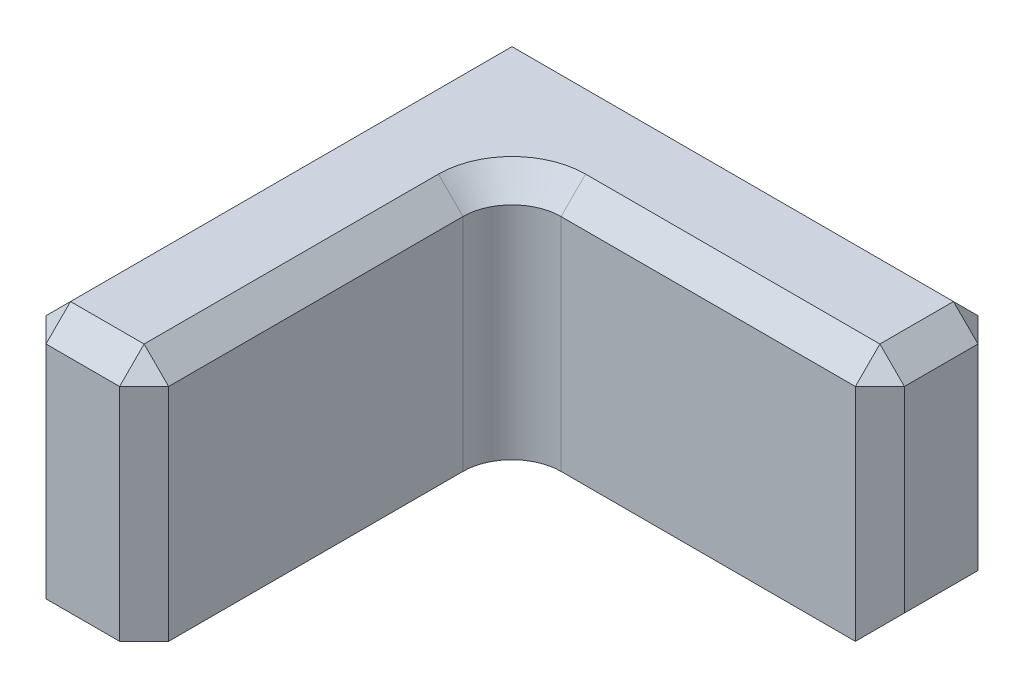
ISO-10303-21;
HEADER;
FILE_DESCRIPTION(('STEP AP214'),'2;1');
FILE_NAME('part.step','',(''),(''),'','','');
FILE_SCHEMA(('AUTOMOTIVE_DESIGN { 1 0 10303 214 1 1 1 1 }'));
ENDSEC;
DATA;
#1=APPLICATION_CONTEXT('core data for automotive mechanical design processes');
#2=APPLICATION_PROTOCOL_DEFINITION('international standard','automotive_design',2000,#1);
#3=PRODUCT_CONTEXT('',#1,'mechanical');
#4=PRODUCT('Part','Part','',(#3));
#5=PRODUCT_RELATED_PRODUCT_CATEGORY('part','',(#4));
#6=PRODUCT_DEFINITION_FORMATION('','',#4);
#7=PRODUCT_DEFINITION_CONTEXT('part definition',#1,'design');
#8=PRODUCT_DEFINITION('design','',#6,#7);
#9=PRODUCT_DEFINITION_SHAPE('','',#8);
#10=(LENGTH_UNIT() NAMED_UNIT(*) SI_UNIT(.MILLI.,.METRE.));
#11=(NAMED_UNIT(*) PLANE_ANGLE_UNIT() SI_UNIT($,.RADIAN.));
#12=(NAMED_UNIT(*) SI_UNIT($,.STERADIAN.) SOLID_ANGLE_UNIT());
#13=UNCERTAINTY_MEASURE_WITH_UNIT(LENGTH_MEASURE(1.E-05),#10,'distance_accuracy_value','');
#14=(GEOMETRIC_REPRESENTATION_CONTEXT(3) GLOBAL_UNCERTAINTY_ASSIGNED_CONTEXT((#13)) GLOBAL_UNIT_ASSIGNED_CONTEXT((#10,
#11,#12)) REPRESENTATION_CONTEXT('',''));
#15=CARTESIAN_POINT('',(0.,0.,0.));
#16=DIRECTION('',(0.,0.,1.));
#17=DIRECTION('',(1.,0.,0.));
#18=AXIS2_PLACEMENT_3D('',#15,#16,#17);
#19=CARTESIAN_POINT('',(20.,10.,0.));
#20=DIRECTION('',(1.,0.,0.));
#21=DIRECTION('',(0.,0.,-1.));
#22=AXIS2_PLACEMENT_3D('',#19,#20,#21);
#23=PLANE('',#22);
#24=DIRECTION('',(0.,0.,1.));
#25=VECTOR('',#24,1.);
#26=CARTESIAN_POINT('',(20.,9.,0.));
#27=LINE('',#26,#25);
#28=CARTESIAN_POINT('',(20.,9.,1.00000000000001));
#29=VERTEX_POINT('',#28);
#30=CARTESIAN_POINT('',(20.,9.,4.));
#31=VERTEX_POINT('',#30);
#32=EDGE_CURVE('E175',#29,#31,#27,.T.);
#33=ORIENTED_EDGE('',*,*,#32,.T.);
#34=DIRECTION('',(0.,-1.,0.));
#35=VECTOR('',#34,1.);
#36=CARTESIAN_POINT('',(20.,0.,4.));
#37=LINE('',#36,#35);
#38=CARTESIAN_POINT('',(20.,1.00000000000001,4.));
#39=VERTEX_POINT('',#38);
#40=EDGE_CURVE('E193',#31,#39,#37,.T.);
#41=ORIENTED_EDGE('',*,*,#40,.T.);
#42=DIRECTION('',(0.,0.,-1.));
#43=VECTOR('',#42,1.);
#44=CARTESIAN_POINT('',(20.,1.00000000000001,0.));
#45=LINE('',#44,#43);
#46=CARTESIAN_POINT('',(20.,1.00000000000001,1.00000000000001));
#47=VERTEX_POINT('',#46);
#48=EDGE_CURVE('E191',#39,#47,#45,.T.);
#49=ORIENTED_EDGE('',*,*,#48,.T.);
#50=DIRECTION('',(0.,1.,0.));
#51=VECTOR('',#50,1.);
#52=CARTESIAN_POINT('',(20.,10.,1.00000000000001));
#53=LINE('',#52,#51);
#54=EDGE_CURVE('E189',#47,#29,#53,.T.);
#55=ORIENTED_EDGE('',*,*,#54,.T.);
#56=EDGE_LOOP('',(#33,#41,#49,#55));
#57=FACE_BOUND('',#56,.T.);
#58=ADVANCED_FACE('F45',(#57),#23,.T.);
#59=CARTESIAN_POINT('',(0.,10.,0.));
#60=DIRECTION('',(0.,0.,-1.));
#61=DIRECTION('',(-1.,0.,0.));
#62=AXIS2_PLACEMENT_3D('',#59,#60,#61);
#63=PLANE('',#62);
#64=DIRECTION('',(1.,0.,0.));
#65=VECTOR('',#64,1.);
#66=CARTESIAN_POINT('',(0.,9.,0.));
#67=LINE('',#66,#65);
#68=CARTESIAN_POINT('',(1.00000000000001,9.,0.));
#69=VERTEX_POINT('',#68);
#70=CARTESIAN_POINT('',(19.,9.,0.));
#71=VERTEX_POINT('',#70);
#72=EDGE_CURVE('E208',#69,#71,#67,.T.);
#73=ORIENTED_EDGE('',*,*,#72,.T.);
#74=DIRECTION('',(0.,-1.,0.));
#75=VECTOR('',#74,1.);
#76=CARTESIAN_POINT('',(19.,10.,0.));
#77=LINE('',#76,#75);
#78=CARTESIAN_POINT('',(19.,0.,0.));
#79=VERTEX_POINT('',#78);
#80=EDGE_CURVE('E210',#71,#79,#77,.T.);
#81=ORIENTED_EDGE('',*,*,#80,.T.);
#82=DIRECTION('',(1.,0.,0.));
#83=VECTOR('',#82,1.);
#84=CARTESIAN_POINT('',(0.,0.,0.));
#85=LINE('',#84,#83);
#86=CARTESIAN_POINT('',(1.00000000000001,0.,0.));
#87=VERTEX_POINT('',#86);
#88=EDGE_CURVE('E294',#87,#79,#85,.T.);
#89=ORIENTED_EDGE('',*,*,#88,.F.);
#90=DIRECTION('',(0.,1.,0.));
#91=VECTOR('',#90,1.);
#92=CARTESIAN_POINT('',(1.00000000000001,10.,0.));
#93=LINE('',#92,#91);
#94=EDGE_CURVE('E206',#87,#69,#93,.T.);
#95=ORIENTED_EDGE('',*,*,#94,.T.);
#96=EDGE_LOOP('',(#73,#81,#89,#95));
#97=FACE_BOUND('',#96,.T.);
#98=ADVANCED_FACE('F337',(#97),#63,.T.);
#99=CARTESIAN_POINT('',(0.,10.,0.));
#100=DIRECTION('',(1.,0.,0.));
#101=DIRECTION('',(0.,0.,-1.));
#102=AXIS2_PLACEMENT_3D('',#99,#100,#101);
#103=PLANE('',#102);
#104=DIRECTION('',(0.,0.,-1.));
#105=VECTOR('',#104,1.);
#106=CARTESIAN_POINT('',(0.,8.99999999999999,0.));
#107=LINE('',#106,#105);
#108=CARTESIAN_POINT('',(0.,8.99999999999999,19.));
#109=VERTEX_POINT('',#108);
#110=CARTESIAN_POINT('',(0.,8.99999999999999,1.));
#111=VERTEX_POINT('',#110);
#112=EDGE_CURVE('E235',#109,#111,#107,.T.);
#113=ORIENTED_EDGE('',*,*,#112,.T.);
#114=DIRECTION('',(0.,-1.,0.));
#115=VECTOR('',#114,1.);
#116=CARTESIAN_POINT('',(0.,0.,1.));
#117=LINE('',#116,#115);
#118=CARTESIAN_POINT('',(0.,0.,1.));
#119=VERTEX_POINT('',#118);
#120=EDGE_CURVE('E237',#111,#119,#117,.T.);
#121=ORIENTED_EDGE('',*,*,#120,.T.);
#122=DIRECTION('',(0.,0.,1.));
#123=VECTOR('',#122,1.);
#124=CARTESIAN_POINT('',(0.,0.,0.));
#125=LINE('',#124,#123);
#126=CARTESIAN_POINT('',(0.,0.,19.));
#127=VERTEX_POINT('',#126);
#128=EDGE_CURVE('E298',#119,#127,#125,.T.);
#129=ORIENTED_EDGE('',*,*,#128,.T.);
#130=DIRECTION('',(0.,1.,0.));
#131=VECTOR('',#130,1.);
#132=CARTESIAN_POINT('',(0.,10.,19.));
#133=LINE('',#132,#131);
#134=EDGE_CURVE('E233',#127,#109,#133,.T.);
#135=ORIENTED_EDGE('',*,*,#134,.T.);
#136=EDGE_LOOP('',(#113,#121,#129,#135));
#137=FACE_BOUND('',#136,.T.);
#138=ADVANCED_FACE('F343',(#137),#103,.F.);
#139=CARTESIAN_POINT('',(0.,10.,20.));
#140=DIRECTION('',(0.,0.,-1.));
#141=DIRECTION('',(-1.,0.,0.));
#142=AXIS2_PLACEMENT_3D('',#139,#140,#141);
#143=PLANE('',#142);
#144=DIRECTION('',(-1.,0.,0.));
#145=VECTOR('',#144,1.);
#146=CARTESIAN_POINT('',(0.,8.99999999999999,20.));
#147=LINE('',#146,#145);
#148=CARTESIAN_POINT('',(3.99999999999999,8.99999999999999,20.));
#149=VERTEX_POINT('',#148);
#150=CARTESIAN_POINT('',(1.00000000000001,8.99999999999999,20.));
#151=VERTEX_POINT('',#150);
#152=EDGE_CURVE('E55',#149,#151,#147,.T.);
#153=ORIENTED_EDGE('',*,*,#152,.T.);
#154=DIRECTION('',(0.,-1.,0.));
#155=VECTOR('',#154,1.);
#156=CARTESIAN_POINT('',(1.00000000000001,10.,20.));
#157=LINE('',#156,#155);
#158=CARTESIAN_POINT('',(1.00000000000001,0.,20.));
#159=VERTEX_POINT('',#158);
#160=EDGE_CURVE('E11',#151,#159,#157,.T.);
#161=ORIENTED_EDGE('',*,*,#160,.T.);
#162=DIRECTION('',(1.,0.,0.));
#163=VECTOR('',#162,1.);
#164=CARTESIAN_POINT('',(0.,0.,20.));
#165=LINE('',#164,#163);
#166=CARTESIAN_POINT('',(3.99999999999999,0.,20.));
#167=VERTEX_POINT('',#166);
#168=EDGE_CURVE('E183',#159,#167,#165,.T.);
#169=ORIENTED_EDGE('',*,*,#168,.T.);
#170=DIRECTION('',(0.,1.,0.));
#171=VECTOR('',#170,1.);
#172=CARTESIAN_POINT('',(3.99999999999999,10.,20.));
#173=LINE('',#172,#171);
#174=EDGE_CURVE('E66',#167,#149,#173,.T.);
#175=ORIENTED_EDGE('',*,*,#174,.T.);
#176=EDGE_LOOP('',(#153,#161,#169,#175));
#177=FACE_BOUND('',#176,.T.);
#178=ADVANCED_FACE('F305',(#177),#143,.F.);
#179=CARTESIAN_POINT('',(5.,10.,0.));
#180=DIRECTION('',(1.,0.,0.));
#181=DIRECTION('',(0.,0.,-1.));
#182=AXIS2_PLACEMENT_3D('',#179,#180,#181);
#183=PLANE('',#182);
#184=DIRECTION('',(0.,-1.,0.));
#185=VECTOR('',#184,1.);
#186=CARTESIAN_POINT('',(5.,10.,7.));
#187=LINE('',#186,#185);
#188=CARTESIAN_POINT('',(5.,0.,7.));
#189=VERTEX_POINT('',#188);
#190=CARTESIAN_POINT('',(5.,9.,7.));
#191=VERTEX_POINT('',#190);
#192=EDGE_CURVE('E166',#189,#191,#187,.F.);
#193=ORIENTED_EDGE('',*,*,#192,.T.);
#194=DIRECTION('',(0.,0.,1.));
#195=VECTOR('',#194,1.);
#196=CARTESIAN_POINT('',(5.,9.,0.));
#197=LINE('',#196,#195);
#198=CARTESIAN_POINT('',(5.,9.,19.));
#199=VERTEX_POINT('',#198);
#200=EDGE_CURVE('E231',#191,#199,#197,.T.);
#201=ORIENTED_EDGE('',*,*,#200,.T.);
#202=DIRECTION('',(0.,-1.,0.));
#203=VECTOR('',#202,1.);
#204=CARTESIAN_POINT('',(5.,0.,19.));
#205=LINE('',#204,#203);
#206=CARTESIAN_POINT('',(5.,0.,19.));
#207=VERTEX_POINT('',#206);
#208=EDGE_CURVE('E229',#199,#207,#205,.T.);
#209=ORIENTED_EDGE('',*,*,#208,.T.);
#210=DIRECTION('',(0.,0.,1.));
#211=VECTOR('',#210,1.);
#212=CARTESIAN_POINT('',(5.,0.,0.));
#213=LINE('',#212,#211);
#214=EDGE_CURVE('E181',#189,#207,#213,.T.);
#215=ORIENTED_EDGE('',*,*,#214,.F.);
#216=EDGE_LOOP('',(#193,#201,#209,#215));
#217=FACE_BOUND('',#216,.T.);
#218=ADVANCED_FACE('F584',(#217),#183,.T.);
#219=CARTESIAN_POINT('',(0.,10.,5.));
#220=DIRECTION('',(0.,0.,-1.));
#221=DIRECTION('',(-1.,0.,0.));
#222=AXIS2_PLACEMENT_3D('',#219,#220,#221);
#223=PLANE('',#222);
#224=DIRECTION('',(1.,0.,0.));
#225=VECTOR('',#224,1.);
#226=CARTESIAN_POINT('',(0.,0.,5.));
#227=LINE('',#226,#225);
#228=CARTESIAN_POINT('',(7.,0.,5.));
#229=VERTEX_POINT('',#228);
#230=CARTESIAN_POINT('',(19.,0.,5.));
#231=VERTEX_POINT('',#230);
#232=EDGE_CURVE('E160',#229,#231,#227,.T.);
#233=ORIENTED_EDGE('',*,*,#232,.T.);
#234=DIRECTION('',(0.,1.,0.));
#235=VECTOR('',#234,1.);
#236=CARTESIAN_POINT('',(19.,10.,5.));
#237=LINE('',#236,#235);
#238=CARTESIAN_POINT('',(19.,8.99999999999999,5.));
#239=VERTEX_POINT('',#238);
#240=EDGE_CURVE('E197',#231,#239,#237,.T.);
#241=ORIENTED_EDGE('',*,*,#240,.T.);
#242=DIRECTION('',(-1.,0.,0.));
#243=VECTOR('',#242,1.);
#244=CARTESIAN_POINT('',(7.,8.99999999999999,5.));
#245=LINE('',#244,#243);
#246=CARTESIAN_POINT('',(7.,8.99999999999999,5.));
#247=VERTEX_POINT('',#246);
#248=EDGE_CURVE('E163',#239,#247,#245,.T.);
#249=ORIENTED_EDGE('',*,*,#248,.T.);
#250=DIRECTION('',(0.,-1.,0.));
#251=VECTOR('',#250,1.);
#252=CARTESIAN_POINT('',(7.,10.,5.));
#253=LINE('',#252,#251);
#254=EDGE_CURVE('E155',#247,#229,#253,.T.);
#255=ORIENTED_EDGE('',*,*,#254,.T.);
#256=EDGE_LOOP('',(#233,#241,#249,#255));
#257=FACE_BOUND('',#256,.T.);
#258=ADVANCED_FACE('F157',(#257),#223,.F.);
#259=CARTESIAN_POINT('',(0.,10.,0.));
#260=DIRECTION('',(0.,1.,0.));
#261=DIRECTION('',(0.,0.,1.));
#262=AXIS2_PLACEMENT_3D('',#259,#260,#261);
#263=PLANE('',#262);
#264=CARTESIAN_POINT('',(7.,10.,7.));
#265=DIRECTION('',(0.,1.,0.));
#266=DIRECTION('',(0.,0.,1.));
#267=AXIS2_PLACEMENT_3D('',#264,#265,#266);
#268=CIRCLE('',#267,3.);
#269=CARTESIAN_POINT('',(3.99999999999999,10.,7.));
#270=VERTEX_POINT('',#269);
#271=CARTESIAN_POINT('',(7.,10.,4.));
#272=VERTEX_POINT('',#271);
#273=EDGE_CURVE('E222',#270,#272,#268,.F.);
#274=ORIENTED_EDGE('',*,*,#273,.T.);
#275=DIRECTION('',(1.,0.,0.));
#276=VECTOR('',#275,1.);
#277=CARTESIAN_POINT('',(20.,10.,4.));
#278=LINE('',#277,#276);
#279=CARTESIAN_POINT('',(19.,10.,4.));
#280=VERTEX_POINT('',#279);
#281=EDGE_CURVE('E224',#272,#280,#278,.T.);
#282=ORIENTED_EDGE('',*,*,#281,.T.);
#283=DIRECTION('',(0.,0.,-1.));
#284=VECTOR('',#283,1.);
#285=CARTESIAN_POINT('',(19.,10.,0.));
#286=LINE('',#285,#284);
#287=CARTESIAN_POINT('',(19.,10.,1.00000000000001));
#288=VERTEX_POINT('',#287);
#289=EDGE_CURVE('E218',#280,#288,#286,.T.);
#290=ORIENTED_EDGE('',*,*,#289,.T.);
#291=DIRECTION('',(-1.,0.,0.));
#292=VECTOR('',#291,1.);
#293=CARTESIAN_POINT('',(0.,10.,1.00000000000001));
#294=LINE('',#293,#292);
#295=CARTESIAN_POINT('',(1.,10.,1.00000000000001));
#296=VERTEX_POINT('',#295);
#297=EDGE_CURVE('E216',#288,#296,#294,.T.);
#298=ORIENTED_EDGE('',*,*,#297,.T.);
#299=DIRECTION('',(0.,0.,1.));
#300=VECTOR('',#299,1.);
#301=CARTESIAN_POINT('',(1.,10.,20.));
#302=LINE('',#301,#300);
#303=CARTESIAN_POINT('',(1.,10.,19.));
#304=VERTEX_POINT('',#303);
#305=EDGE_CURVE('E214',#296,#304,#302,.T.);
#306=ORIENTED_EDGE('',*,*,#305,.T.);
#307=DIRECTION('',(1.,0.,0.));
#308=VECTOR('',#307,1.);
#309=CARTESIAN_POINT('',(5.,10.,19.));
#310=LINE('',#309,#308);
#311=CARTESIAN_POINT('',(3.99999999999999,10.,19.));
#312=VERTEX_POINT('',#311);
#313=EDGE_CURVE('E212',#304,#312,#310,.T.);
#314=ORIENTED_EDGE('',*,*,#313,.T.);
#315=DIRECTION('',(0.,0.,-1.));
#316=VECTOR('',#315,1.);
#317=CARTESIAN_POINT('',(3.99999999999999,10.,0.));
#318=LINE('',#317,#316);
#319=EDGE_CURVE('E220',#312,#270,#318,.T.);
#320=ORIENTED_EDGE('',*,*,#319,.T.);
#321=EDGE_LOOP('',(#274,#282,#290,#298,#306,#314,#320));
#322=FACE_BOUND('',#321,.T.);
#323=ADVANCED_FACE('F319',(#322),#263,.T.);
#324=CARTESIAN_POINT('',(0.,0.,0.));
#325=DIRECTION('',(0.,1.,0.));
#326=DIRECTION('',(0.,0.,1.));
#327=AXIS2_PLACEMENT_3D('',#324,#325,#326);
#328=PLANE('',#327);
#329=ORIENTED_EDGE('',*,*,#88,.T.);
#330=DIRECTION('',(0.,0.,1.));
#331=VECTOR('',#330,1.);
#332=CARTESIAN_POINT('',(19.,0.,5.));
#333=LINE('',#332,#331);
#334=EDGE_CURVE('E180',#79,#231,#333,.T.);
#335=ORIENTED_EDGE('',*,*,#334,.T.);
#336=ORIENTED_EDGE('',*,*,#232,.F.);
#337=CARTESIAN_POINT('',(7.,0.,7.));
#338=DIRECTION('',(0.,1.,0.));
#339=DIRECTION('',(0.,0.,1.));
#340=AXIS2_PLACEMENT_3D('',#337,#338,#339);
#341=CIRCLE('',#340,2.);
#342=EDGE_CURVE('E169',#229,#189,#341,.T.);
#343=ORIENTED_EDGE('',*,*,#342,.T.);
#344=ORIENTED_EDGE('',*,*,#214,.T.);
#345=DIRECTION('',(-0.707106781186549,0.,0.707106781186546));
#346=VECTOR('',#345,1.);
#347=CARTESIAN_POINT('',(5.,0.,19.));
#348=LINE('',#347,#346);
#349=EDGE_CURVE('E199',#207,#167,#348,.T.);
#350=ORIENTED_EDGE('',*,*,#349,.T.);
#351=ORIENTED_EDGE('',*,*,#168,.F.);
#352=DIRECTION('',(0.707106781186549,0.,0.707106781186546));
#353=VECTOR('',#352,1.);
#354=CARTESIAN_POINT('',(1.00000000000001,0.,20.));
#355=LINE('',#354,#353);
#356=EDGE_CURVE('E201',#159,#127,#355,.F.);
#357=ORIENTED_EDGE('',*,*,#356,.T.);
#358=ORIENTED_EDGE('',*,*,#128,.F.);
#359=DIRECTION('',(0.707106781186549,0.,-0.707106781186546));
#360=VECTOR('',#359,1.);
#361=CARTESIAN_POINT('',(0.,0.,1.));
#362=LINE('',#361,#360);
#363=EDGE_CURVE('E203',#119,#87,#362,.T.);
#364=ORIENTED_EDGE('',*,*,#363,.T.);
#365=EDGE_LOOP('',(#329,#335,#336,#343,#344,#350,#351,#357,#358,#364));
#366=FACE_BOUND('',#365,.T.);
#367=ADVANCED_FACE('F178',(#366),#328,.F.);
#368=CARTESIAN_POINT('',(7.,10.,7.));
#369=DIRECTION('',(0.,-1.,0.));
#370=DIRECTION('',(0.,0.,-1.));
#371=AXIS2_PLACEMENT_3D('',#368,#369,#370);
#372=CYLINDRICAL_SURFACE('',#371,2.);
#373=ORIENTED_EDGE('',*,*,#254,.F.);
#374=CARTESIAN_POINT('',(7.,8.99999999999999,7.));
#375=DIRECTION('',(0.,1.,0.));
#376=DIRECTION('',(0.,0.,1.));
#377=AXIS2_PLACEMENT_3D('',#374,#375,#376);
#378=CIRCLE('',#377,2.);
#379=EDGE_CURVE('E227',#247,#191,#378,.T.);
#380=ORIENTED_EDGE('',*,*,#379,.T.);
#381=ORIENTED_EDGE('',*,*,#192,.F.);
#382=ORIENTED_EDGE('',*,*,#342,.F.);
#383=EDGE_LOOP('',(#373,#380,#381,#382));
#384=FACE_BOUND('',#383,.T.);
#385=ADVANCED_FACE('F170',(#384),#372,.F.);
#386=CARTESIAN_POINT('',(1.00000000000001,10.,20.));
#387=DIRECTION('',(0.707106781186546,0.,-0.707106781186549));
#388=DIRECTION('',(0.,-1.,0.));
#389=AXIS2_PLACEMENT_3D('',#386,#387,#388);
#390=PLANE('',#389);
#391=DIRECTION('',(-0.707106781186549,0.,-0.707106781186546));
#392=VECTOR('',#391,1.);
#393=CARTESIAN_POINT('',(0.500000000000004,8.99999999999999,19.5));
#394=LINE('',#393,#392);
#395=EDGE_CURVE('E50',#109,#151,#394,.F.);
#396=ORIENTED_EDGE('',*,*,#395,.F.);
#397=ORIENTED_EDGE('',*,*,#134,.F.);
#398=ORIENTED_EDGE('',*,*,#356,.F.);
#399=ORIENTED_EDGE('',*,*,#160,.F.);
#400=EDGE_LOOP('',(#396,#397,#398,#399));
#401=FACE_BOUND('',#400,.T.);
#402=ADVANCED_FACE('F48',(#401),#390,.F.);
#403=CARTESIAN_POINT('',(1.,10.,19.));
#404=DIRECTION('',(-0.577350269189626,0.577350269189624,0.577350269189628));
#405=DIRECTION('',(0.707106781186549,0.,0.707106781186546));
#406=AXIS2_PLACEMENT_3D('',#403,#404,#405);
#407=PLANE('',#406);
#408=DIRECTION('',(-0.707106781186546,-0.707106781186549,0.));
#409=VECTOR('',#408,1.);
#410=CARTESIAN_POINT('',(1.,10.,19.));
#411=LINE('',#410,#409);
#412=EDGE_CURVE('E286',#109,#304,#411,.F.);
#413=ORIENTED_EDGE('',*,*,#412,.F.);
#414=ORIENTED_EDGE('',*,*,#395,.T.);
#415=DIRECTION('',(0.,0.707106781186549,-0.707106781186546));
#416=VECTOR('',#415,1.);
#417=CARTESIAN_POINT('',(1.,10.,19.));
#418=LINE('',#417,#416);
#419=EDGE_CURVE('E288',#304,#151,#418,.F.);
#420=ORIENTED_EDGE('',*,*,#419,.F.);
#421=EDGE_LOOP('',(#413,#414,#420));
#422=FACE_BOUND('',#421,.T.);
#423=ADVANCED_FACE('F327',(#422),#407,.T.);
#424=CARTESIAN_POINT('',(5.,10.,19.));
#425=DIRECTION('',(0.707106781186546,0.,0.707106781186549));
#426=DIRECTION('',(0.,1.,0.));
#427=AXIS2_PLACEMENT_3D('',#424,#425,#426);
#428=PLANE('',#427);
#429=ORIENTED_EDGE('',*,*,#349,.F.);
#430=ORIENTED_EDGE('',*,*,#208,.F.);
#431=DIRECTION('',(0.707106781186549,0.,-0.707106781186546));
#432=VECTOR('',#431,1.);
#433=CARTESIAN_POINT('',(5.,9.,19.));
#434=LINE('',#433,#432);
#435=EDGE_CURVE('E283',#149,#199,#434,.T.);
#436=ORIENTED_EDGE('',*,*,#435,.F.);
#437=ORIENTED_EDGE('',*,*,#174,.F.);
#438=EDGE_LOOP('',(#429,#430,#436,#437));
#439=FACE_BOUND('',#438,.T.);
#440=ADVANCED_FACE('F310',(#439),#428,.T.);
#441=CARTESIAN_POINT('',(0.,10.,19.));
#442=DIRECTION('',(0.,0.707106781186546,0.707106781186549));
#443=DIRECTION('',(-1.,0.,0.));
#444=AXIS2_PLACEMENT_3D('',#441,#442,#443);
#445=PLANE('',#444);
#446=ORIENTED_EDGE('',*,*,#419,.T.);
#447=ORIENTED_EDGE('',*,*,#152,.F.);
#448=DIRECTION('',(0.,-0.707106781186549,0.707106781186546));
#449=VECTOR('',#448,1.);
#450=CARTESIAN_POINT('',(3.99999999999999,9.5,19.5));
#451=LINE('',#450,#449);
#452=EDGE_CURVE('E280',#312,#149,#451,.T.);
#453=ORIENTED_EDGE('',*,*,#452,.F.);
#454=ORIENTED_EDGE('',*,*,#313,.F.);
#455=EDGE_LOOP('',(#446,#447,#453,#454));
#456=FACE_BOUND('',#455,.T.);
#457=ADVANCED_FACE('F317',(#456),#445,.T.);
#458=CARTESIAN_POINT('',(1.,10.,0.));
#459=DIRECTION('',(-0.707106781186549,0.707106781186546,0.));
#460=DIRECTION('',(0.,0.,-1.));
#461=AXIS2_PLACEMENT_3D('',#458,#459,#460);
#462=PLANE('',#461);
#463=ORIENTED_EDGE('',*,*,#412,.T.);
#464=ORIENTED_EDGE('',*,*,#305,.F.);
#465=DIRECTION('',(0.707106781186546,0.707106781186549,0.));
#466=VECTOR('',#465,1.);
#467=CARTESIAN_POINT('',(1.,10.,1.00000000000001));
#468=LINE('',#467,#466);
#469=EDGE_CURVE('E277',#111,#296,#468,.T.);
#470=ORIENTED_EDGE('',*,*,#469,.F.);
#471=ORIENTED_EDGE('',*,*,#112,.F.);
#472=EDGE_LOOP('',(#463,#464,#470,#471));
#473=FACE_BOUND('',#472,.T.);
#474=ADVANCED_FACE('F326',(#473),#462,.T.);
#475=CARTESIAN_POINT('',(0.,10.,1.));
#476=DIRECTION('',(-0.707106781186546,0.,-0.707106781186549));
#477=DIRECTION('',(0.,1.,0.));
#478=AXIS2_PLACEMENT_3D('',#475,#476,#477);
#479=PLANE('',#478);
#480=ORIENTED_EDGE('',*,*,#363,.F.);
#481=ORIENTED_EDGE('',*,*,#120,.F.);
#482=DIRECTION('',(-0.707106781186549,0.,0.707106781186546));
#483=VECTOR('',#482,1.);
#484=CARTESIAN_POINT('',(0.500000000000004,8.99999999999999,0.500000000000002));
#485=LINE('',#484,#483);
#486=EDGE_CURVE('E274',#69,#111,#485,.T.);
#487=ORIENTED_EDGE('',*,*,#486,.F.);
#488=ORIENTED_EDGE('',*,*,#94,.F.);
#489=EDGE_LOOP('',(#480,#481,#487,#488));
#490=FACE_BOUND('',#489,.T.);
#491=ADVANCED_FACE('F433',(#490),#479,.T.);
#492=CARTESIAN_POINT('',(5.,9.,19.));
#493=DIRECTION('',(0.577350269189624,0.577350269189626,0.577350269189628));
#494=DIRECTION('',(0.,-0.707106781186549,0.707106781186546));
#495=AXIS2_PLACEMENT_3D('',#492,#493,#494);
#496=PLANE('',#495);
#497=ORIENTED_EDGE('',*,*,#452,.T.);
#498=ORIENTED_EDGE('',*,*,#435,.T.);
#499=DIRECTION('',(0.707106781186549,-0.707106781186546,0.));
#500=VECTOR('',#499,1.);
#501=CARTESIAN_POINT('',(5.,9.,19.));
#502=LINE('',#501,#500);
#503=EDGE_CURVE('E271',#312,#199,#502,.T.);
#504=ORIENTED_EDGE('',*,*,#503,.F.);
#505=EDGE_LOOP('',(#497,#498,#504));
#506=FACE_BOUND('',#505,.T.);
#507=ADVANCED_FACE('F315',(#506),#496,.T.);
#508=CARTESIAN_POINT('',(1.,10.,1.00000000000001));
#509=DIRECTION('',(-0.577350269189626,0.577350269189626,-0.577350269189626));
#510=DIRECTION('',(-0.707106781186548,-0.707106781186548,0.));
#511=AXIS2_PLACEMENT_3D('',#508,#509,#510);
#512=PLANE('',#511);
#513=ORIENTED_EDGE('',*,*,#486,.T.);
#514=ORIENTED_EDGE('',*,*,#469,.T.);
#515=DIRECTION('',(0.,0.707106781186546,0.707106781186549));
#516=VECTOR('',#515,1.);
#517=CARTESIAN_POINT('',(1.,10.,1.00000000000001));
#518=LINE('',#517,#516);
#519=EDGE_CURVE('E268',#69,#296,#518,.T.);
#520=ORIENTED_EDGE('',*,*,#519,.F.);
#521=EDGE_LOOP('',(#513,#514,#520));
#522=FACE_BOUND('',#521,.T.);
#523=ADVANCED_FACE('F420',(#522),#512,.T.);
#524=CARTESIAN_POINT('',(5.,9.,0.));
#525=DIRECTION('',(-0.707106781186546,-0.707106781186549,0.));
#526=DIRECTION('',(0.,0.,1.));
#527=AXIS2_PLACEMENT_3D('',#524,#525,#526);
#528=PLANE('',#527);
#529=ORIENTED_EDGE('',*,*,#503,.T.);
#530=ORIENTED_EDGE('',*,*,#200,.F.);
#531=DIRECTION('',(0.707106781186549,-0.707106781186546,0.));
#532=VECTOR('',#531,1.);
#533=CARTESIAN_POINT('',(3.99999999999999,10.,7.));
#534=LINE('',#533,#532);
#535=EDGE_CURVE('E265',#270,#191,#534,.T.);
#536=ORIENTED_EDGE('',*,*,#535,.F.);
#537=ORIENTED_EDGE('',*,*,#319,.F.);
#538=EDGE_LOOP('',(#529,#530,#536,#537));
#539=FACE_BOUND('',#538,.T.);
#540=ADVANCED_FACE('F413',(#539),#528,.F.);
#541=CARTESIAN_POINT('',(0.,9.,0.));
#542=DIRECTION('',(0.,-0.707106781186549,0.707106781186546));
#543=DIRECTION('',(1.,0.,0.));
#544=AXIS2_PLACEMENT_3D('',#541,#542,#543);
#545=PLANE('',#544);
#546=ORIENTED_EDGE('',*,*,#519,.T.);
#547=ORIENTED_EDGE('',*,*,#297,.F.);
#548=DIRECTION('',(0.,-0.707106781186546,-0.707106781186549));
#549=VECTOR('',#548,1.);
#550=CARTESIAN_POINT('',(19.,9.5,0.500000000000004));
#551=LINE('',#550,#549);
#552=EDGE_CURVE('E262',#71,#288,#551,.F.);
#553=ORIENTED_EDGE('',*,*,#552,.F.);
#554=ORIENTED_EDGE('',*,*,#72,.F.);
#555=EDGE_LOOP('',(#546,#547,#553,#554));
#556=FACE_BOUND('',#555,.T.);
#557=ADVANCED_FACE('F406',(#556),#545,.F.);
#558=CARTESIAN_POINT('',(7.,10.,7.));
#559=DIRECTION('',(0.,1.,0.));
#560=DIRECTION('',(0.,0.,1.));
#561=AXIS2_PLACEMENT_3D('',#558,#559,#560);
#562=CONICAL_SURFACE('',#561,3.,0.785398163397447);
#563=ORIENTED_EDGE('',*,*,#535,.T.);
#564=ORIENTED_EDGE('',*,*,#379,.F.);
#565=DIRECTION('',(0.,-0.707106781186549,0.707106781186546));
#566=VECTOR('',#565,1.);
#567=CARTESIAN_POINT('',(7.,10.,4.));
#568=LINE('',#567,#566);
#569=EDGE_CURVE('E259',#272,#247,#568,.T.);
#570=ORIENTED_EDGE('',*,*,#569,.F.);
#571=ORIENTED_EDGE('',*,*,#273,.F.);
#572=EDGE_LOOP('',(#563,#564,#570,#571));
#573=FACE_BOUND('',#572,.T.);
#574=ADVANCED_FACE('F399',(#573),#562,.F.);
#575=CARTESIAN_POINT('',(20.,9.,1.00000000000001));
#576=DIRECTION('',(0.577350269189626,0.577350269189628,-0.577350269189624));
#577=DIRECTION('',(-0.707106781186549,0.707106781186546,0.));
#578=AXIS2_PLACEMENT_3D('',#575,#576,#577);
#579=PLANE('',#578);
#580=DIRECTION('',(0.707106781186546,0.,0.707106781186549));
#581=VECTOR('',#580,1.);
#582=CARTESIAN_POINT('',(20.,9.,1.00000000000001));
#583=LINE('',#582,#581);
#584=EDGE_CURVE('E253',#71,#29,#583,.T.);
#585=ORIENTED_EDGE('',*,*,#584,.F.);
#586=ORIENTED_EDGE('',*,*,#552,.T.);
#587=DIRECTION('',(-0.707106781186549,0.707106781186546,0.));
#588=VECTOR('',#587,1.);
#589=CARTESIAN_POINT('',(20.,9.,1.00000000000001));
#590=LINE('',#589,#588);
#591=EDGE_CURVE('E256',#29,#288,#590,.T.);
#592=ORIENTED_EDGE('',*,*,#591,.F.);
#593=EDGE_LOOP('',(#585,#586,#592));
#594=FACE_BOUND('',#593,.T.);
#595=ADVANCED_FACE('F392',(#594),#579,.T.);
#596=CARTESIAN_POINT('',(0.,10.,4.));
#597=DIRECTION('',(0.,0.707106781186546,0.707106781186549));
#598=DIRECTION('',(-1.,0.,0.));
#599=AXIS2_PLACEMENT_3D('',#596,#597,#598);
#600=PLANE('',#599);
#601=ORIENTED_EDGE('',*,*,#569,.T.);
#602=ORIENTED_EDGE('',*,*,#248,.F.);
#603=DIRECTION('',(0.,-0.707106781186549,0.707106781186546));
#604=VECTOR('',#603,1.);
#605=CARTESIAN_POINT('',(19.,8.99999999999999,5.));
#606=LINE('',#605,#604);
#607=EDGE_CURVE('E250',#280,#239,#606,.T.);
#608=ORIENTED_EDGE('',*,*,#607,.F.);
#609=ORIENTED_EDGE('',*,*,#281,.F.);
#610=EDGE_LOOP('',(#601,#602,#608,#609));
#611=FACE_BOUND('',#610,.T.);
#612=ADVANCED_FACE('F385',(#611),#600,.T.);
#613=CARTESIAN_POINT('',(20.,9.,0.));
#614=DIRECTION('',(-0.707106781186546,-0.707106781186549,0.));
#615=DIRECTION('',(0.,0.,1.));
#616=AXIS2_PLACEMENT_3D('',#613,#614,#615);
#617=PLANE('',#616);
#618=ORIENTED_EDGE('',*,*,#591,.T.);
#619=ORIENTED_EDGE('',*,*,#289,.F.);
#620=DIRECTION('',(0.707106781186549,-0.707106781186546,0.));
#621=VECTOR('',#620,1.);
#622=CARTESIAN_POINT('',(19.5,9.5,3.99999999999999));
#623=LINE('',#622,#621);
#624=EDGE_CURVE('E248',#31,#280,#623,.F.);
#625=ORIENTED_EDGE('',*,*,#624,.F.);
#626=ORIENTED_EDGE('',*,*,#32,.F.);
#627=EDGE_LOOP('',(#618,#619,#625,#626));
#628=FACE_BOUND('',#627,.T.);
#629=ADVANCED_FACE('F378',(#628),#617,.F.);
#630=CARTESIAN_POINT('',(19.,10.,0.));
#631=DIRECTION('',(-0.707106781186549,0.,0.707106781186546));
#632=DIRECTION('',(0.,-1.,0.));
#633=AXIS2_PLACEMENT_3D('',#630,#631,#632);
#634=PLANE('',#633);
#635=ORIENTED_EDGE('',*,*,#584,.T.);
#636=ORIENTED_EDGE('',*,*,#54,.F.);
#637=DIRECTION('',(0.577350269189624,0.577350269189626,0.577350269189626));
#638=VECTOR('',#637,1.);
#639=CARTESIAN_POINT('',(22.3333333333333,3.33333333333334,3.33333333333334));
#640=LINE('',#639,#638);
#641=EDGE_CURVE('E245',#79,#47,#640,.T.);
#642=ORIENTED_EDGE('',*,*,#641,.F.);
#643=ORIENTED_EDGE('',*,*,#80,.F.);
#644=EDGE_LOOP('',(#635,#636,#642,#643));
#645=FACE_BOUND('',#644,.T.);
#646=ADVANCED_FACE('F371',(#645),#634,.F.);
#647=CARTESIAN_POINT('',(19.,8.99999999999999,5.));
#648=DIRECTION('',(0.577350269189624,0.577350269189626,0.577350269189628));
#649=DIRECTION('',(0.,-0.707106781186549,0.707106781186546));
#650=AXIS2_PLACEMENT_3D('',#647,#648,#649);
#651=PLANE('',#650);
#652=ORIENTED_EDGE('',*,*,#624,.T.);
#653=ORIENTED_EDGE('',*,*,#607,.T.);
#654=DIRECTION('',(0.707106781186549,0.,-0.707106781186546));
#655=VECTOR('',#654,1.);
#656=CARTESIAN_POINT('',(19.,8.99999999999999,5.));
#657=LINE('',#656,#655);
#658=EDGE_CURVE('E243',#31,#239,#657,.F.);
#659=ORIENTED_EDGE('',*,*,#658,.F.);
#660=EDGE_LOOP('',(#652,#653,#659));
#661=FACE_BOUND('',#660,.T.);
#662=ADVANCED_FACE('F364',(#661),#651,.T.);
#663=CARTESIAN_POINT('',(19.,0.,0.));
#664=DIRECTION('',(0.707106781186549,-0.707106781186546,0.));
#665=DIRECTION('',(0.,0.,-1.));
#666=AXIS2_PLACEMENT_3D('',#663,#664,#665);
#667=PLANE('',#666);
#668=ORIENTED_EDGE('',*,*,#641,.T.);
#669=ORIENTED_EDGE('',*,*,#48,.F.);
#670=DIRECTION('',(-0.577350269189626,-0.577350269189628,0.577350269189624));
#671=VECTOR('',#670,1.);
#672=CARTESIAN_POINT('',(20.6666666666667,1.66666666666667,3.33333333333334));
#673=LINE('',#672,#671);
#674=EDGE_CURVE('E241',#231,#39,#673,.F.);
#675=ORIENTED_EDGE('',*,*,#674,.F.);
#676=ORIENTED_EDGE('',*,*,#334,.F.);
#677=EDGE_LOOP('',(#668,#669,#675,#676));
#678=FACE_BOUND('',#677,.T.);
#679=ADVANCED_FACE('F357',(#678),#667,.T.);
#680=CARTESIAN_POINT('',(20.,10.,4.));
#681=DIRECTION('',(0.707106781186546,0.,0.707106781186549));
#682=DIRECTION('',(0.,1.,0.));
#683=AXIS2_PLACEMENT_3D('',#680,#681,#682);
#684=PLANE('',#683);
#685=ORIENTED_EDGE('',*,*,#658,.T.);
#686=ORIENTED_EDGE('',*,*,#240,.F.);
#687=ORIENTED_EDGE('',*,*,#674,.T.);
#688=ORIENTED_EDGE('',*,*,#40,.F.);
#689=EDGE_LOOP('',(#685,#686,#687,#688));
#690=FACE_BOUND('',#689,.T.);
#691=ADVANCED_FACE('F351',(#690),#684,.T.);
#692=CLOSED_SHELL('',(#58,#98,#138,#178,#218,#258,#323,#367,#385,#402,#423,#440,#457,#474,#491,
#507,#523,#540,#557,#574,#595,#612,#629,#646,#662,#679,#691));
#693=MANIFOLD_SOLID_BREP('B2',#692);
#694=ADVANCED_BREP_SHAPE_REPRESENTATION('',(#18,#693),#14);
#695=SHAPE_DEFINITION_REPRESENTATION(#9,#694);
ENDSEC;
END-ISO-10303-21;
